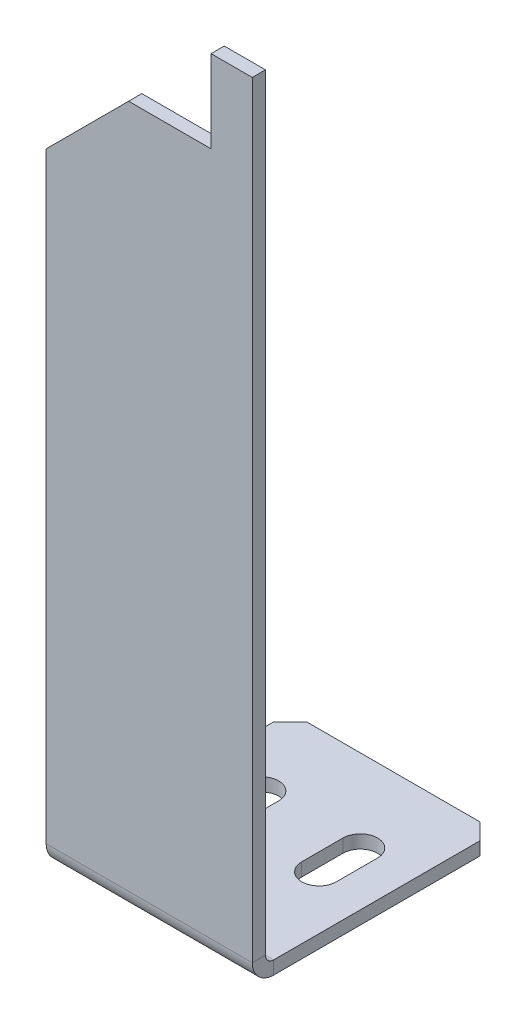
ISO-10303-21;
HEADER;
FILE_DESCRIPTION(('STEP AP214'),'2;1');
FILE_NAME('part.step','',(''),(''),'','','');
FILE_SCHEMA(('AUTOMOTIVE_DESIGN { 1 0 10303 214 1 1 1 1 }'));
ENDSEC;
DATA;
#1=APPLICATION_CONTEXT('core data for automotive mechanical design processes');
#2=APPLICATION_PROTOCOL_DEFINITION('international standard','automotive_design',2000,#1);
#3=PRODUCT_CONTEXT('',#1,'mechanical');
#4=PRODUCT('Part','Part','',(#3));
#5=PRODUCT_RELATED_PRODUCT_CATEGORY('part','',(#4));
#6=PRODUCT_DEFINITION_FORMATION('','',#4);
#7=PRODUCT_DEFINITION_CONTEXT('part definition',#1,'design');
#8=PRODUCT_DEFINITION('design','',#6,#7);
#9=PRODUCT_DEFINITION_SHAPE('','',#8);
#10=(LENGTH_UNIT() NAMED_UNIT(*) SI_UNIT(.MILLI.,.METRE.));
#11=(NAMED_UNIT(*) PLANE_ANGLE_UNIT() SI_UNIT($,.RADIAN.));
#12=(NAMED_UNIT(*) SI_UNIT($,.STERADIAN.) SOLID_ANGLE_UNIT());
#13=UNCERTAINTY_MEASURE_WITH_UNIT(LENGTH_MEASURE(1.E-05),#10,'distance_accuracy_value','');
#14=(GEOMETRIC_REPRESENTATION_CONTEXT(3) GLOBAL_UNCERTAINTY_ASSIGNED_CONTEXT((#13)) GLOBAL_UNIT_ASSIGNED_CONTEXT((#10,
#11,#12)) REPRESENTATION_CONTEXT('',''));
#15=CARTESIAN_POINT('',(0.,0.,0.));
#16=DIRECTION('',(0.,0.,1.));
#17=DIRECTION('',(1.,0.,0.));
#18=AXIS2_PLACEMENT_3D('',#15,#16,#17);
#19=CARTESIAN_POINT('',(24.9999999999999,1.60000000000002,14.0000000000001));
#20=DIRECTION('',(0.,-0.999999999999999,0.));
#21=DIRECTION('',(1.,0.,0.));
#22=AXIS2_PLACEMENT_3D('',#19,#20,#21);
#23=PLANE('',#22);
#24=DIRECTION('',(0.,0.,-0.999999999999999));
#25=VECTOR('',#24,1.);
#26=CARTESIAN_POINT('',(20.6,1.60000000000002,1.00000000000006));
#27=LINE('',#26,#25);
#28=CARTESIAN_POINT('',(20.6,1.60000000000002,1.00000000000006));
#29=VERTEX_POINT('',#28);
#30=CARTESIAN_POINT('',(20.6,1.60000000000002,-3.99999999999995));
#31=VERTEX_POINT('',#30);
#32=EDGE_CURVE('E295',#29,#31,#27,.T.);
#33=ORIENTED_EDGE('',*,*,#32,.F.);
#34=CARTESIAN_POINT('',(18.5,1.59999999999993,1.00000000000006));
#35=DIRECTION('',(0.,-0.999999999999999,0.));
#36=DIRECTION('',(1.,0.,0.));
#37=AXIS2_PLACEMENT_3D('',#34,#35,#36);
#38=CIRCLE('',#37,2.1);
#39=CARTESIAN_POINT('',(16.4,1.59999999999993,1.00000000000006));
#40=VERTEX_POINT('',#39);
#41=EDGE_CURVE('E298',#40,#29,#38,.F.);
#42=ORIENTED_EDGE('',*,*,#41,.F.);
#43=DIRECTION('',(0.,0.,0.999999999999999));
#44=VECTOR('',#43,1.);
#45=CARTESIAN_POINT('',(16.4,1.59999999999993,1.00000000000006));
#46=LINE('',#45,#44);
#47=CARTESIAN_POINT('',(16.4,1.59999999999993,-3.99999999999993));
#48=VERTEX_POINT('',#47);
#49=EDGE_CURVE('E315',#48,#40,#46,.T.);
#50=ORIENTED_EDGE('',*,*,#49,.F.);
#51=CARTESIAN_POINT('',(18.5,1.59999999999993,-3.99999999999995));
#52=DIRECTION('',(0.,-0.999999999999999,0.));
#53=DIRECTION('',(1.,0.,0.));
#54=AXIS2_PLACEMENT_3D('',#51,#52,#53);
#55=CIRCLE('',#54,2.1);
#56=EDGE_CURVE('E293',#31,#48,#55,.F.);
#57=ORIENTED_EDGE('',*,*,#56,.F.);
#58=EDGE_LOOP('',(#33,#42,#50,#57));
#59=FACE_BOUND('',#58,.T.);
#60=DIRECTION('',(0.,0.,-0.999999999999999));
#61=VECTOR('',#60,1.);
#62=CARTESIAN_POINT('',(8.59999999999994,1.59999999999993,1.00000000000006));
#63=LINE('',#62,#61);
#64=CARTESIAN_POINT('',(8.59999999999994,1.59999999999993,1.00000000000006));
#65=VERTEX_POINT('',#64);
#66=CARTESIAN_POINT('',(8.59999999999994,1.59999999999993,-3.99999999999995));
#67=VERTEX_POINT('',#66);
#68=EDGE_CURVE('E264',#65,#67,#63,.T.);
#69=ORIENTED_EDGE('',*,*,#68,.F.);
#70=CARTESIAN_POINT('',(6.49999999999995,1.59999999999993,1.00000000000006));
#71=DIRECTION('',(0.,-0.999999999999999,0.));
#72=DIRECTION('',(1.,0.,0.));
#73=AXIS2_PLACEMENT_3D('',#70,#71,#72);
#74=CIRCLE('',#73,2.1);
#75=CARTESIAN_POINT('',(4.39999999999996,1.59999999999991,1.00000000000006));
#76=VERTEX_POINT('',#75);
#77=EDGE_CURVE('E267',#76,#65,#74,.F.);
#78=ORIENTED_EDGE('',*,*,#77,.F.);
#79=DIRECTION('',(0.,0.,0.999999999999999));
#80=VECTOR('',#79,1.);
#81=CARTESIAN_POINT('',(4.39999999999996,1.59999999999991,1.00000000000006));
#82=LINE('',#81,#80);
#83=CARTESIAN_POINT('',(4.39999999999996,1.59999999999991,-3.99999999999995));
#84=VERTEX_POINT('',#83);
#85=EDGE_CURVE('E284',#84,#76,#82,.T.);
#86=ORIENTED_EDGE('',*,*,#85,.F.);
#87=CARTESIAN_POINT('',(6.49999999999995,1.59999999999993,-3.99999999999995));
#88=DIRECTION('',(0.,-0.999999999999999,0.));
#89=DIRECTION('',(1.,0.,0.));
#90=AXIS2_PLACEMENT_3D('',#87,#88,#89);
#91=CIRCLE('',#90,2.1);
#92=EDGE_CURVE('E260',#67,#84,#91,.F.);
#93=ORIENTED_EDGE('',*,*,#92,.F.);
#94=EDGE_LOOP('',(#69,#78,#86,#93));
#95=FACE_BOUND('',#94,.T.);
#96=DIRECTION('',(0.,0.,-0.999999999999999));
#97=VECTOR('',#96,1.);
#98=CARTESIAN_POINT('',(24.9999999999999,1.60000000000002,14.0000000000001));
#99=LINE('',#98,#97);
#100=CARTESIAN_POINT('',(24.9999999999999,1.60000000000002,13.0000000000001));
#101=VERTEX_POINT('',#100);
#102=CARTESIAN_POINT('',(24.9999999999999,1.60000000000002,-11.9999999999998));
#103=VERTEX_POINT('',#102);
#104=EDGE_CURVE('E329',#101,#103,#99,.T.);
#105=ORIENTED_EDGE('',*,*,#104,.T.);
#106=DIRECTION('',(0.707106781186545,0.,0.707106781186549));
#107=VECTOR('',#106,1.);
#108=CARTESIAN_POINT('',(22.9999999999999,1.60000000000002,-13.9999999999998));
#109=LINE('',#108,#107);
#110=CARTESIAN_POINT('',(22.9999999999999,1.60000000000002,-13.9999999999998));
#111=VERTEX_POINT('',#110);
#112=EDGE_CURVE('E46',#103,#111,#109,.F.);
#113=ORIENTED_EDGE('',*,*,#112,.T.);
#114=DIRECTION('',(-1.,0.,0.));
#115=VECTOR('',#114,1.);
#116=CARTESIAN_POINT('',(24.9999999999999,1.60000000000002,-13.9999999999998));
#117=LINE('',#116,#115);
#118=CARTESIAN_POINT('',(2.,1.59999999999999,-13.9999999999999));
#119=VERTEX_POINT('',#118);
#120=EDGE_CURVE('E324',#111,#119,#117,.T.);
#121=ORIENTED_EDGE('',*,*,#120,.T.);
#122=DIRECTION('',(0.707106781186545,0.,-0.707106781186549));
#123=VECTOR('',#122,1.);
#124=CARTESIAN_POINT('',(2.,1.59999999999999,-13.9999999999998));
#125=LINE('',#124,#123);
#126=CARTESIAN_POINT('',(0.,1.59999999999999,-11.9999999999998));
#127=VERTEX_POINT('',#126);
#128=EDGE_CURVE('E53',#119,#127,#125,.F.);
#129=ORIENTED_EDGE('',*,*,#128,.T.);
#130=DIRECTION('',(0.,0.,-0.999999999999999));
#131=VECTOR('',#130,1.);
#132=CARTESIAN_POINT('',(0.,1.59999999999999,14.0000000000001));
#133=LINE('',#132,#131);
#134=CARTESIAN_POINT('',(0.,1.59999999999999,13.0000000000001));
#135=VERTEX_POINT('',#134);
#136=EDGE_CURVE('E336',#135,#127,#133,.T.);
#137=ORIENTED_EDGE('',*,*,#136,.F.);
#138=DIRECTION('',(1.,0.,0.));
#139=VECTOR('',#138,1.);
#140=CARTESIAN_POINT('',(24.9999999999999,1.60000000000002,13.0000000000001));
#141=LINE('',#140,#139);
#142=EDGE_CURVE('E253',#101,#135,#141,.F.);
#143=ORIENTED_EDGE('',*,*,#142,.F.);
#144=EDGE_LOOP('',(#105,#113,#121,#129,#137,#143));
#145=FACE_BOUND('',#144,.T.);
#146=ADVANCED_FACE('F38',(#59,#95,#145),#23,.F.);
#147=CARTESIAN_POINT('',(24.9999999999999,0.,14.0000000000001));
#148=DIRECTION('',(0.,-0.999999999999999,0.));
#149=DIRECTION('',(1.,0.,0.));
#150=AXIS2_PLACEMENT_3D('',#147,#148,#149);
#151=PLANE('',#150);
#152=CARTESIAN_POINT('',(18.5,0.,1.00000000000006));
#153=DIRECTION('',(0.,-0.999999999999999,0.));
#154=DIRECTION('',(-1.,0.,0.));
#155=AXIS2_PLACEMENT_3D('',#152,#153,#154);
#156=CIRCLE('',#155,2.1);
#157=CARTESIAN_POINT('',(20.6,0.,1.00000000000006));
#158=VERTEX_POINT('',#157);
#159=CARTESIAN_POINT('',(16.4,0.,1.00000000000006));
#160=VERTEX_POINT('',#159);
#161=EDGE_CURVE('E301',#158,#160,#156,.T.);
#162=ORIENTED_EDGE('',*,*,#161,.F.);
#163=DIRECTION('',(0.,0.,0.999999999999999));
#164=VECTOR('',#163,1.);
#165=CARTESIAN_POINT('',(20.6,0.,1.00000000000006));
#166=LINE('',#165,#164);
#167=CARTESIAN_POINT('',(20.6,0.,-3.99999999999995));
#168=VERTEX_POINT('',#167);
#169=EDGE_CURVE('E309',#168,#158,#166,.T.);
#170=ORIENTED_EDGE('',*,*,#169,.F.);
#171=CARTESIAN_POINT('',(18.5,0.,-3.99999999999995));
#172=DIRECTION('',(0.,-0.999999999999999,0.));
#173=DIRECTION('',(1.,0.,0.));
#174=AXIS2_PLACEMENT_3D('',#171,#172,#173);
#175=CIRCLE('',#174,2.1);
#176=CARTESIAN_POINT('',(16.4,0.,-3.99999999999995));
#177=VERTEX_POINT('',#176);
#178=EDGE_CURVE('E306',#177,#168,#175,.T.);
#179=ORIENTED_EDGE('',*,*,#178,.F.);
#180=DIRECTION('',(0.,0.,-0.999999999999999));
#181=VECTOR('',#180,1.);
#182=CARTESIAN_POINT('',(16.4,0.,1.00000000000006));
#183=LINE('',#182,#181);
#184=EDGE_CURVE('E303',#160,#177,#183,.T.);
#185=ORIENTED_EDGE('',*,*,#184,.F.);
#186=EDGE_LOOP('',(#162,#170,#179,#185));
#187=FACE_BOUND('',#186,.T.);
#188=CARTESIAN_POINT('',(6.49999999999995,0.,1.00000000000006));
#189=DIRECTION('',(0.,-0.999999999999999,0.));
#190=DIRECTION('',(-1.,0.,0.));
#191=AXIS2_PLACEMENT_3D('',#188,#189,#190);
#192=CIRCLE('',#191,2.1);
#193=CARTESIAN_POINT('',(8.59999999999994,0.,1.00000000000006));
#194=VERTEX_POINT('',#193);
#195=CARTESIAN_POINT('',(4.39999999999996,0.,1.00000000000006));
#196=VERTEX_POINT('',#195);
#197=EDGE_CURVE('E270',#194,#196,#192,.T.);
#198=ORIENTED_EDGE('',*,*,#197,.F.);
#199=DIRECTION('',(0.,0.,0.999999999999999));
#200=VECTOR('',#199,1.);
#201=CARTESIAN_POINT('',(8.59999999999994,0.,1.00000000000006));
#202=LINE('',#201,#200);
#203=CARTESIAN_POINT('',(8.59999999999994,0.,-3.99999999999995));
#204=VERTEX_POINT('',#203);
#205=EDGE_CURVE('E278',#204,#194,#202,.T.);
#206=ORIENTED_EDGE('',*,*,#205,.F.);
#207=CARTESIAN_POINT('',(6.49999999999995,0.,-3.99999999999995));
#208=DIRECTION('',(0.,-0.999999999999999,0.));
#209=DIRECTION('',(1.,0.,0.));
#210=AXIS2_PLACEMENT_3D('',#207,#208,#209);
#211=CIRCLE('',#210,2.1);
#212=CARTESIAN_POINT('',(4.39999999999996,0.,-3.99999999999995));
#213=VERTEX_POINT('',#212);
#214=EDGE_CURVE('E275',#213,#204,#211,.T.);
#215=ORIENTED_EDGE('',*,*,#214,.F.);
#216=DIRECTION('',(0.,0.,-0.999999999999999));
#217=VECTOR('',#216,1.);
#218=CARTESIAN_POINT('',(4.39999999999996,0.,1.00000000000006));
#219=LINE('',#218,#217);
#220=EDGE_CURVE('E272',#196,#213,#219,.T.);
#221=ORIENTED_EDGE('',*,*,#220,.F.);
#222=EDGE_LOOP('',(#198,#206,#215,#221));
#223=FACE_BOUND('',#222,.T.);
#224=DIRECTION('',(-1.,0.,0.));
#225=VECTOR('',#224,1.);
#226=CARTESIAN_POINT('',(24.9999999999999,0.,-13.9999999999998));
#227=LINE('',#226,#225);
#228=CARTESIAN_POINT('',(22.9999999999999,0.,-13.9999999999998));
#229=VERTEX_POINT('',#228);
#230=CARTESIAN_POINT('',(2.,0.,-13.9999999999999));
#231=VERTEX_POINT('',#230);
#232=EDGE_CURVE('E326',#229,#231,#227,.T.);
#233=ORIENTED_EDGE('',*,*,#232,.F.);
#234=DIRECTION('',(-0.707106781186545,0.,-0.707106781186549));
#235=VECTOR('',#234,1.);
#236=CARTESIAN_POINT('',(38.,0.,1.00000000000015));
#237=LINE('',#236,#235);
#238=CARTESIAN_POINT('',(24.9999999999999,0.,-11.9999999999998));
#239=VERTEX_POINT('',#238);
#240=EDGE_CURVE('E354',#229,#239,#237,.F.);
#241=ORIENTED_EDGE('',*,*,#240,.T.);
#242=DIRECTION('',(0.,0.,-0.999999999999999));
#243=VECTOR('',#242,1.);
#244=CARTESIAN_POINT('',(24.9999999999999,0.,14.0000000000001));
#245=LINE('',#244,#243);
#246=CARTESIAN_POINT('',(24.9999999999999,0.,13.0000000000001));
#247=VERTEX_POINT('',#246);
#248=EDGE_CURVE('E331',#247,#239,#245,.T.);
#249=ORIENTED_EDGE('',*,*,#248,.F.);
#250=DIRECTION('',(1.,0.,0.));
#251=VECTOR('',#250,1.);
#252=CARTESIAN_POINT('',(24.9999999999999,0.,13.0000000000001));
#253=LINE('',#252,#251);
#254=CARTESIAN_POINT('',(0.,0.,13.0000000000001));
#255=VERTEX_POINT('',#254);
#256=EDGE_CURVE('E240',#247,#255,#253,.F.);
#257=ORIENTED_EDGE('',*,*,#256,.T.);
#258=DIRECTION('',(0.,0.,-0.999999999999999));
#259=VECTOR('',#258,1.);
#260=CARTESIAN_POINT('',(0.,0.,14.0000000000001));
#261=LINE('',#260,#259);
#262=CARTESIAN_POINT('',(0.,0.,-11.9999999999998));
#263=VERTEX_POINT('',#262);
#264=EDGE_CURVE('E333',#255,#263,#261,.T.);
#265=ORIENTED_EDGE('',*,*,#264,.T.);
#266=DIRECTION('',(-0.707106781186545,0.,0.707106781186549));
#267=VECTOR('',#266,1.);
#268=CARTESIAN_POINT('',(-0.500000000000174,0.,-11.4999999999998));
#269=LINE('',#268,#267);
#270=EDGE_CURVE('E352',#263,#231,#269,.F.);
#271=ORIENTED_EDGE('',*,*,#270,.T.);
#272=EDGE_LOOP('',(#233,#241,#249,#257,#265,#271));
#273=FACE_BOUND('',#272,.T.);
#274=ADVANCED_FACE('F369',(#187,#223,#273),#151,.T.);
#275=CARTESIAN_POINT('',(24.9999999999999,1.60000000000002,14.0000000000001));
#276=DIRECTION('',(1.,0.,0.));
#277=DIRECTION('',(0.,0.,-0.999999999999999));
#278=AXIS2_PLACEMENT_3D('',#275,#276,#277);
#279=PLANE('',#278);
#280=ORIENTED_EDGE('',*,*,#248,.T.);
#281=DIRECTION('',(0.,0.999999999999999,0.));
#282=VECTOR('',#281,1.);
#283=CARTESIAN_POINT('',(24.9999999999999,1.60000000000002,-11.9999999999998));
#284=LINE('',#283,#282);
#285=EDGE_CURVE('E61',#239,#103,#284,.T.);
#286=ORIENTED_EDGE('',*,*,#285,.T.);
#287=ORIENTED_EDGE('',*,*,#104,.F.);
#288=DIRECTION('',(0.,-0.999999999999999,0.));
#289=VECTOR('',#288,1.);
#290=CARTESIAN_POINT('',(24.9999999999999,1.60000000000002,13.0000000000001));
#291=LINE('',#290,#289);
#292=EDGE_CURVE('E247',#101,#247,#291,.T.);
#293=ORIENTED_EDGE('',*,*,#292,.T.);
#294=EDGE_LOOP('',(#280,#286,#287,#293));
#295=FACE_BOUND('',#294,.T.);
#296=ADVANCED_FACE('F370',(#295),#279,.T.);
#297=CARTESIAN_POINT('',(0.,0.,14.0000000000001));
#298=DIRECTION('',(-1.,0.,0.));
#299=DIRECTION('',(0.,0.,0.999999999999999));
#300=AXIS2_PLACEMENT_3D('',#297,#298,#299);
#301=PLANE('',#300);
#302=ORIENTED_EDGE('',*,*,#136,.T.);
#303=DIRECTION('',(0.,-0.999999999999999,0.));
#304=VECTOR('',#303,1.);
#305=CARTESIAN_POINT('',(0.,0.,-11.9999999999998));
#306=LINE('',#305,#304);
#307=EDGE_CURVE('E11',#127,#263,#306,.T.);
#308=ORIENTED_EDGE('',*,*,#307,.T.);
#309=ORIENTED_EDGE('',*,*,#264,.F.);
#310=DIRECTION('',(0.,-0.999999999999999,0.));
#311=VECTOR('',#310,1.);
#312=CARTESIAN_POINT('',(0.,1.59999999999999,13.0000000000001));
#313=LINE('',#312,#311);
#314=EDGE_CURVE('E257',#135,#255,#313,.T.);
#315=ORIENTED_EDGE('',*,*,#314,.F.);
#316=EDGE_LOOP('',(#302,#308,#309,#315));
#317=FACE_BOUND('',#316,.T.);
#318=ADVANCED_FACE('F382',(#317),#301,.T.);
#319=CARTESIAN_POINT('',(0.,1.59999999999999,-13.9999999999998));
#320=DIRECTION('',(0.,0.,-0.999999999999999));
#321=DIRECTION('',(-1.,0.,0.));
#322=AXIS2_PLACEMENT_3D('',#319,#320,#321);
#323=PLANE('',#322);
#324=ORIENTED_EDGE('',*,*,#120,.F.);
#325=DIRECTION('',(0.,-0.999999999999999,0.));
#326=VECTOR('',#325,1.);
#327=CARTESIAN_POINT('',(22.9999999999999,1.60000000000002,-13.9999999999998));
#328=LINE('',#327,#326);
#329=EDGE_CURVE('E349',#111,#229,#328,.T.);
#330=ORIENTED_EDGE('',*,*,#329,.T.);
#331=ORIENTED_EDGE('',*,*,#232,.T.);
#332=DIRECTION('',(0.,0.999999999999999,0.));
#333=VECTOR('',#332,1.);
#334=CARTESIAN_POINT('',(2.,1.59999999999999,-13.9999999999998));
#335=LINE('',#334,#333);
#336=EDGE_CURVE('E346',#231,#119,#335,.T.);
#337=ORIENTED_EDGE('',*,*,#336,.T.);
#338=EDGE_LOOP('',(#324,#330,#331,#337));
#339=FACE_BOUND('',#338,.T.);
#340=ADVANCED_FACE('F363',(#339),#323,.T.);
#341=CARTESIAN_POINT('',(18.5,1.60099999999994,1.00000000000006));
#342=DIRECTION('',(0.,-0.999999999999999,0.));
#343=DIRECTION('',(1.,0.,0.));
#344=AXIS2_PLACEMENT_3D('',#341,#342,#343);
#345=CYLINDRICAL_SURFACE('',#344,2.1);
#346=ORIENTED_EDGE('',*,*,#41,.T.);
#347=DIRECTION('',(0.,-0.999999999999999,0.));
#348=VECTOR('',#347,1.);
#349=CARTESIAN_POINT('',(20.6,1.60100000000002,1.00000000000006));
#350=LINE('',#349,#348);
#351=EDGE_CURVE('E313',#29,#158,#350,.T.);
#352=ORIENTED_EDGE('',*,*,#351,.T.);
#353=ORIENTED_EDGE('',*,*,#161,.T.);
#354=DIRECTION('',(0.,-0.999999999999999,0.));
#355=VECTOR('',#354,1.);
#356=CARTESIAN_POINT('',(16.4,1.60099999999994,1.00000000000006));
#357=LINE('',#356,#355);
#358=EDGE_CURVE('E312',#40,#160,#357,.T.);
#359=ORIENTED_EDGE('',*,*,#358,.F.);
#360=EDGE_LOOP('',(#346,#352,#353,#359));
#361=FACE_BOUND('',#360,.T.);
#362=ADVANCED_FACE('F615',(#361),#345,.F.);
#363=CARTESIAN_POINT('',(20.6,1.60100000000002,1.00000000000006));
#364=DIRECTION('',(1.,0.,0.));
#365=DIRECTION('',(0.,0.999999999999999,0.));
#366=AXIS2_PLACEMENT_3D('',#363,#364,#365);
#367=PLANE('',#366);
#368=ORIENTED_EDGE('',*,*,#32,.T.);
#369=DIRECTION('',(0.,-0.999999999999999,0.));
#370=VECTOR('',#369,1.);
#371=CARTESIAN_POINT('',(20.6,1.60100000000002,-3.99999999999995));
#372=LINE('',#371,#370);
#373=EDGE_CURVE('E316',#31,#168,#372,.T.);
#374=ORIENTED_EDGE('',*,*,#373,.T.);
#375=ORIENTED_EDGE('',*,*,#169,.T.);
#376=ORIENTED_EDGE('',*,*,#351,.F.);
#377=EDGE_LOOP('',(#368,#374,#375,#376));
#378=FACE_BOUND('',#377,.T.);
#379=ADVANCED_FACE('F604',(#378),#367,.F.);
#380=CARTESIAN_POINT('',(18.5,1.60099999999994,-3.99999999999995));
#381=DIRECTION('',(0.,-0.999999999999999,0.));
#382=DIRECTION('',(1.,0.,0.));
#383=AXIS2_PLACEMENT_3D('',#380,#381,#382);
#384=CYLINDRICAL_SURFACE('',#383,2.1);
#385=ORIENTED_EDGE('',*,*,#56,.T.);
#386=DIRECTION('',(0.,-0.999999999999999,0.));
#387=VECTOR('',#386,1.);
#388=CARTESIAN_POINT('',(16.4,1.60099999999994,-3.99999999999995));
#389=LINE('',#388,#387);
#390=EDGE_CURVE('E318',#48,#177,#389,.T.);
#391=ORIENTED_EDGE('',*,*,#390,.T.);
#392=ORIENTED_EDGE('',*,*,#178,.T.);
#393=ORIENTED_EDGE('',*,*,#373,.F.);
#394=EDGE_LOOP('',(#385,#391,#392,#393));
#395=FACE_BOUND('',#394,.T.);
#396=ADVANCED_FACE('F593',(#395),#384,.F.);
#397=CARTESIAN_POINT('',(16.4,1.60099999999994,1.00000000000006));
#398=DIRECTION('',(-1.,0.,0.));
#399=DIRECTION('',(0.,-0.999999999999999,0.));
#400=AXIS2_PLACEMENT_3D('',#397,#398,#399);
#401=PLANE('',#400);
#402=ORIENTED_EDGE('',*,*,#49,.T.);
#403=ORIENTED_EDGE('',*,*,#358,.T.);
#404=ORIENTED_EDGE('',*,*,#184,.T.);
#405=ORIENTED_EDGE('',*,*,#390,.F.);
#406=EDGE_LOOP('',(#402,#403,#404,#405));
#407=FACE_BOUND('',#406,.T.);
#408=ADVANCED_FACE('F582',(#407),#401,.F.);
#409=CARTESIAN_POINT('',(6.49999999999995,1.60099999999991,1.00000000000006));
#410=DIRECTION('',(0.,-0.999999999999999,0.));
#411=DIRECTION('',(1.,0.,0.));
#412=AXIS2_PLACEMENT_3D('',#409,#410,#411);
#413=CYLINDRICAL_SURFACE('',#412,2.1);
#414=ORIENTED_EDGE('',*,*,#77,.T.);
#415=DIRECTION('',(0.,-0.999999999999999,0.));
#416=VECTOR('',#415,1.);
#417=CARTESIAN_POINT('',(8.59999999999994,1.60099999999994,1.00000000000006));
#418=LINE('',#417,#416);
#419=EDGE_CURVE('E282',#65,#194,#418,.T.);
#420=ORIENTED_EDGE('',*,*,#419,.T.);
#421=ORIENTED_EDGE('',*,*,#197,.T.);
#422=DIRECTION('',(0.,-0.999999999999999,0.));
#423=VECTOR('',#422,1.);
#424=CARTESIAN_POINT('',(4.39999999999996,1.60099999999991,1.00000000000006));
#425=LINE('',#424,#423);
#426=EDGE_CURVE('E281',#76,#196,#425,.T.);
#427=ORIENTED_EDGE('',*,*,#426,.F.);
#428=EDGE_LOOP('',(#414,#420,#421,#427));
#429=FACE_BOUND('',#428,.T.);
#430=ADVANCED_FACE('F571',(#429),#413,.F.);
#431=CARTESIAN_POINT('',(8.59999999999994,1.60099999999994,1.00000000000006));
#432=DIRECTION('',(1.,0.,0.));
#433=DIRECTION('',(0.,0.999999999999999,0.));
#434=AXIS2_PLACEMENT_3D('',#431,#432,#433);
#435=PLANE('',#434);
#436=ORIENTED_EDGE('',*,*,#68,.T.);
#437=DIRECTION('',(0.,-0.999999999999999,0.));
#438=VECTOR('',#437,1.);
#439=CARTESIAN_POINT('',(8.59999999999994,1.60099999999994,-3.99999999999995));
#440=LINE('',#439,#438);
#441=EDGE_CURVE('E285',#67,#204,#440,.T.);
#442=ORIENTED_EDGE('',*,*,#441,.T.);
#443=ORIENTED_EDGE('',*,*,#205,.T.);
#444=ORIENTED_EDGE('',*,*,#419,.F.);
#445=EDGE_LOOP('',(#436,#442,#443,#444));
#446=FACE_BOUND('',#445,.T.);
#447=ADVANCED_FACE('F560',(#446),#435,.F.);
#448=CARTESIAN_POINT('',(6.49999999999995,1.60099999999994,-3.99999999999995));
#449=DIRECTION('',(0.,-0.999999999999999,0.));
#450=DIRECTION('',(1.,0.,0.));
#451=AXIS2_PLACEMENT_3D('',#448,#449,#450);
#452=CYLINDRICAL_SURFACE('',#451,2.1);
#453=ORIENTED_EDGE('',*,*,#92,.T.);
#454=DIRECTION('',(0.,-0.999999999999999,0.));
#455=VECTOR('',#454,1.);
#456=CARTESIAN_POINT('',(4.39999999999996,1.60099999999991,-3.99999999999995));
#457=LINE('',#456,#455);
#458=EDGE_CURVE('E287',#84,#213,#457,.T.);
#459=ORIENTED_EDGE('',*,*,#458,.T.);
#460=ORIENTED_EDGE('',*,*,#214,.T.);
#461=ORIENTED_EDGE('',*,*,#441,.F.);
#462=EDGE_LOOP('',(#453,#459,#460,#461));
#463=FACE_BOUND('',#462,.T.);
#464=ADVANCED_FACE('F548',(#463),#452,.F.);
#465=CARTESIAN_POINT('',(4.39999999999996,1.60099999999991,1.00000000000006));
#466=DIRECTION('',(-1.,0.,0.));
#467=DIRECTION('',(0.,0.,0.999999999999999));
#468=AXIS2_PLACEMENT_3D('',#465,#466,#467);
#469=PLANE('',#468);
#470=ORIENTED_EDGE('',*,*,#85,.T.);
#471=ORIENTED_EDGE('',*,*,#426,.T.);
#472=ORIENTED_EDGE('',*,*,#220,.T.);
#473=ORIENTED_EDGE('',*,*,#458,.F.);
#474=EDGE_LOOP('',(#470,#471,#472,#473));
#475=FACE_BOUND('',#474,.T.);
#476=ADVANCED_FACE('F537',(#475),#469,.F.);
#477=CARTESIAN_POINT('',(0.,2.59999999999999,13.0000000000001));
#478=DIRECTION('',(-1.,0.,0.));
#479=DIRECTION('',(0.,0.,0.999999999999999));
#480=AXIS2_PLACEMENT_3D('',#477,#478,#479);
#481=PLANE('',#480);
#482=DIRECTION('',(0.,0.,0.999999999999999));
#483=VECTOR('',#482,1.);
#484=CARTESIAN_POINT('',(0.,2.59999999999999,14.0000000000001));
#485=LINE('',#484,#483);
#486=CARTESIAN_POINT('',(0.,2.59999999999999,14.0000000000001));
#487=VERTEX_POINT('',#486);
#488=CARTESIAN_POINT('',(0.,2.59999999999999,15.6000000000001));
#489=VERTEX_POINT('',#488);
#490=EDGE_CURVE('E201',#487,#489,#485,.T.);
#491=ORIENTED_EDGE('',*,*,#490,.F.);
#492=CARTESIAN_POINT('',(0.,2.59999999999999,13.0000000000001));
#493=DIRECTION('',(1.,0.,0.));
#494=DIRECTION('',(0.,0.,-0.999999999999999));
#495=AXIS2_PLACEMENT_3D('',#492,#493,#494);
#496=CIRCLE('',#495,0.999999999999997);
#497=EDGE_CURVE('E250',#135,#487,#496,.F.);
#498=ORIENTED_EDGE('',*,*,#497,.F.);
#499=ORIENTED_EDGE('',*,*,#314,.T.);
#500=CARTESIAN_POINT('',(0.,2.59999999999999,13.0000000000001));
#501=DIRECTION('',(1.,0.,0.));
#502=DIRECTION('',(0.,0.,-0.999999999999999));
#503=AXIS2_PLACEMENT_3D('',#500,#501,#502);
#504=CIRCLE('',#503,2.6);
#505=EDGE_CURVE('E243',#255,#489,#504,.F.);
#506=ORIENTED_EDGE('',*,*,#505,.T.);
#507=EDGE_LOOP('',(#491,#498,#499,#506));
#508=FACE_BOUND('',#507,.T.);
#509=ADVANCED_FACE('F391',(#508),#481,.T.);
#510=CARTESIAN_POINT('',(24.9999999999999,2.60000000000002,13.0000000000001));
#511=DIRECTION('',(-1.,0.,0.));
#512=DIRECTION('',(0.,0.,0.999999999999999));
#513=AXIS2_PLACEMENT_3D('',#510,#511,#512);
#514=PLANE('',#513);
#515=CARTESIAN_POINT('',(24.9999999999999,2.60000000000002,13.0000000000001));
#516=DIRECTION('',(1.,0.,0.));
#517=DIRECTION('',(0.,0.,-0.999999999999999));
#518=AXIS2_PLACEMENT_3D('',#515,#516,#517);
#519=CIRCLE('',#518,0.999999999999997);
#520=CARTESIAN_POINT('',(24.9999999999999,2.60000000000002,14.0000000000001));
#521=VERTEX_POINT('',#520);
#522=EDGE_CURVE('E239',#521,#101,#519,.T.);
#523=ORIENTED_EDGE('',*,*,#522,.F.);
#524=DIRECTION('',(0.,0.,0.999999999999999));
#525=VECTOR('',#524,1.);
#526=CARTESIAN_POINT('',(24.9999999999999,2.60000000000002,14.0000000000001));
#527=LINE('',#526,#525);
#528=CARTESIAN_POINT('',(24.9999999999999,2.60000000000002,15.6000000000001));
#529=VERTEX_POINT('',#528);
#530=EDGE_CURVE('E216',#521,#529,#527,.T.);
#531=ORIENTED_EDGE('',*,*,#530,.T.);
#532=CARTESIAN_POINT('',(24.9999999999999,2.60000000000002,13.0000000000001));
#533=DIRECTION('',(1.,0.,0.));
#534=DIRECTION('',(0.,0.,-0.999999999999999));
#535=AXIS2_PLACEMENT_3D('',#532,#533,#534);
#536=CIRCLE('',#535,2.6);
#537=EDGE_CURVE('E244',#529,#247,#536,.T.);
#538=ORIENTED_EDGE('',*,*,#537,.T.);
#539=ORIENTED_EDGE('',*,*,#292,.F.);
#540=EDGE_LOOP('',(#523,#531,#538,#539));
#541=FACE_BOUND('',#540,.T.);
#542=ADVANCED_FACE('F373',(#541),#514,.F.);
#543=CARTESIAN_POINT('',(24.9999999999999,2.60000000000002,13.0000000000001));
#544=DIRECTION('',(1.,0.,0.));
#545=DIRECTION('',(0.,0.,0.999999999999999));
#546=AXIS2_PLACEMENT_3D('',#543,#544,#545);
#547=CYLINDRICAL_SURFACE('',#546,2.6);
#548=ORIENTED_EDGE('',*,*,#256,.F.);
#549=ORIENTED_EDGE('',*,*,#537,.F.);
#550=DIRECTION('',(1.,0.,0.));
#551=VECTOR('',#550,1.);
#552=CARTESIAN_POINT('',(24.9999999999999,2.60000000000002,15.6000000000001));
#553=LINE('',#552,#551);
#554=EDGE_CURVE('E219',#489,#529,#553,.T.);
#555=ORIENTED_EDGE('',*,*,#554,.F.);
#556=ORIENTED_EDGE('',*,*,#505,.F.);
#557=EDGE_LOOP('',(#548,#549,#555,#556));
#558=FACE_BOUND('',#557,.T.);
#559=ADVANCED_FACE('F387',(#558),#547,.T.);
#560=CARTESIAN_POINT('',(24.9999999999999,2.60000000000002,13.0000000000001));
#561=DIRECTION('',(1.,0.,0.));
#562=DIRECTION('',(0.,0.,0.999999999999999));
#563=AXIS2_PLACEMENT_3D('',#560,#561,#562);
#564=CYLINDRICAL_SURFACE('',#563,0.999999999999997);
#565=ORIENTED_EDGE('',*,*,#142,.T.);
#566=ORIENTED_EDGE('',*,*,#497,.T.);
#567=DIRECTION('',(1.,0.,0.));
#568=VECTOR('',#567,1.);
#569=CARTESIAN_POINT('',(0.,2.59999999999999,14.0000000000001));
#570=LINE('',#569,#568);
#571=EDGE_CURVE('E214',#487,#521,#570,.T.);
#572=ORIENTED_EDGE('',*,*,#571,.T.);
#573=ORIENTED_EDGE('',*,*,#522,.T.);
#574=EDGE_LOOP('',(#565,#566,#572,#573));
#575=FACE_BOUND('',#574,.T.);
#576=ADVANCED_FACE('F376',(#575),#564,.F.);
#577=CARTESIAN_POINT('',(25.0000000000001,95.5999999999998,15.6000000000001));
#578=DIRECTION('',(-1.,0.,0.));
#579=DIRECTION('',(0.,-0.999999999999999,0.));
#580=AXIS2_PLACEMENT_3D('',#577,#578,#579);
#581=PLANE('',#580);
#582=ORIENTED_EDGE('',*,*,#530,.F.);
#583=DIRECTION('',(0.,0.999999999999999,0.));
#584=VECTOR('',#583,1.);
#585=CARTESIAN_POINT('',(25.0000000000001,95.5999999999998,14.0000000000001));
#586=LINE('',#585,#584);
#587=CARTESIAN_POINT('',(25.0000000000001,95.5999999999998,14.0000000000001));
#588=VERTEX_POINT('',#587);
#589=EDGE_CURVE('E224',#521,#588,#586,.T.);
#590=ORIENTED_EDGE('',*,*,#589,.T.);
#591=DIRECTION('',(0.,0.,-0.999999999999999));
#592=VECTOR('',#591,1.);
#593=CARTESIAN_POINT('',(25.0000000000001,95.5999999999998,15.6000000000001));
#594=LINE('',#593,#592);
#595=CARTESIAN_POINT('',(25.0000000000001,95.5999999999998,15.6000000000001));
#596=VERTEX_POINT('',#595);
#597=EDGE_CURVE('E231',#596,#588,#594,.T.);
#598=ORIENTED_EDGE('',*,*,#597,.F.);
#599=DIRECTION('',(0.,0.999999999999999,0.));
#600=VECTOR('',#599,1.);
#601=CARTESIAN_POINT('',(25.0000000000001,95.5999999999998,15.6000000000001));
#602=LINE('',#601,#600);
#603=EDGE_CURVE('E225',#529,#596,#602,.T.);
#604=ORIENTED_EDGE('',*,*,#603,.F.);
#605=EDGE_LOOP('',(#582,#590,#598,#604));
#606=FACE_BOUND('',#605,.T.);
#607=ADVANCED_FACE('F400',(#606),#581,.F.);
#608=CARTESIAN_POINT('',(0.,1.59999999999999,15.6000000000001));
#609=DIRECTION('',(1.,0.,0.));
#610=DIRECTION('',(0.,0.999999999999999,0.));
#611=AXIS2_PLACEMENT_3D('',#608,#609,#610);
#612=PLANE('',#611);
#613=DIRECTION('',(0.,-0.999999999999999,0.));
#614=VECTOR('',#613,1.);
#615=CARTESIAN_POINT('',(0.,1.59999999999999,15.6000000000001));
#616=LINE('',#615,#614);
#617=CARTESIAN_POINT('',(2.22044604925031E-13,75.6,15.6));
#618=VERTEX_POINT('',#617);
#619=EDGE_CURVE('E229',#618,#489,#616,.T.);
#620=ORIENTED_EDGE('',*,*,#619,.F.);
#621=DIRECTION('',(0.,0.,-0.999999999999999));
#622=VECTOR('',#621,1.);
#623=CARTESIAN_POINT('',(2.22044604925031E-13,75.6,15.6));
#624=LINE('',#623,#622);
#625=CARTESIAN_POINT('',(2.22044604925031E-13,75.6,14.));
#626=VERTEX_POINT('',#625);
#627=EDGE_CURVE('E338',#618,#626,#624,.T.);
#628=ORIENTED_EDGE('',*,*,#627,.T.);
#629=DIRECTION('',(0.,-0.999999999999999,0.));
#630=VECTOR('',#629,1.);
#631=CARTESIAN_POINT('',(0.,1.59999999999999,14.0000000000001));
#632=LINE('',#631,#630);
#633=EDGE_CURVE('E227',#626,#487,#632,.T.);
#634=ORIENTED_EDGE('',*,*,#633,.T.);
#635=ORIENTED_EDGE('',*,*,#490,.T.);
#636=EDGE_LOOP('',(#620,#628,#634,#635));
#637=FACE_BOUND('',#636,.T.);
#638=ADVANCED_FACE('F404',(#637),#612,.F.);
#639=CARTESIAN_POINT('',(25.0000000000001,95.5999999999998,15.6000000000001));
#640=DIRECTION('',(0.,0.,0.999999999999999));
#641=DIRECTION('',(1.,0.,0.));
#642=AXIS2_PLACEMENT_3D('',#639,#640,#641);
#643=PLANE('',#642);
#644=DIRECTION('',(-1.,0.,0.));
#645=VECTOR('',#644,1.);
#646=CARTESIAN_POINT('',(2.22044604925031E-13,85.5999999999998,15.6));
#647=LINE('',#646,#645);
#648=CARTESIAN_POINT('',(20.0000000000002,85.5999999999998,15.6));
#649=VERTEX_POINT('',#648);
#650=CARTESIAN_POINT('',(10.0000000000002,85.5999999999998,15.6000000000001));
#651=VERTEX_POINT('',#650);
#652=EDGE_CURVE('E182',#649,#651,#647,.T.);
#653=ORIENTED_EDGE('',*,*,#652,.T.);
#654=DIRECTION('',(0.70710678118655,0.707106781186545,0.));
#655=VECTOR('',#654,1.);
#656=CARTESIAN_POINT('',(22.5000000000002,98.0999999999997,15.6));
#657=LINE('',#656,#655);
#658=EDGE_CURVE('E344',#651,#618,#657,.F.);
#659=ORIENTED_EDGE('',*,*,#658,.T.);
#660=ORIENTED_EDGE('',*,*,#619,.T.);
#661=ORIENTED_EDGE('',*,*,#554,.T.);
#662=ORIENTED_EDGE('',*,*,#603,.T.);
#663=DIRECTION('',(-1.,0.,0.));
#664=VECTOR('',#663,1.);
#665=CARTESIAN_POINT('',(2.22044604925031E-13,95.5999999999998,15.6));
#666=LINE('',#665,#664);
#667=CARTESIAN_POINT('',(20.0000000000002,95.5999999999998,15.6));
#668=VERTEX_POINT('',#667);
#669=EDGE_CURVE('E207',#596,#668,#666,.T.);
#670=ORIENTED_EDGE('',*,*,#669,.T.);
#671=DIRECTION('',(0.,-0.999999999999999,0.));
#672=VECTOR('',#671,1.);
#673=CARTESIAN_POINT('',(20.0000000000002,95.5999999999998,15.6));
#674=LINE('',#673,#672);
#675=EDGE_CURVE('E194',#668,#649,#674,.T.);
#676=ORIENTED_EDGE('',*,*,#675,.T.);
#677=EDGE_LOOP('',(#653,#659,#660,#661,#662,#670,#676));
#678=FACE_BOUND('',#677,.T.);
#679=ADVANCED_FACE('F205',(#678),#643,.T.);
#680=CARTESIAN_POINT('',(25.0000000000001,95.5999999999998,14.0000000000001));
#681=DIRECTION('',(0.,0.,0.999999999999999));
#682=DIRECTION('',(1.,0.,0.));
#683=AXIS2_PLACEMENT_3D('',#680,#681,#682);
#684=PLANE('',#683);
#685=ORIENTED_EDGE('',*,*,#633,.F.);
#686=DIRECTION('',(-0.70710678118655,-0.707106781186545,0.));
#687=VECTOR('',#686,1.);
#688=CARTESIAN_POINT('',(2.22044604925031E-13,75.6,14.));
#689=LINE('',#688,#687);
#690=CARTESIAN_POINT('',(10.0000000000002,85.5999999999998,14.0000000000001));
#691=VERTEX_POINT('',#690);
#692=EDGE_CURVE('E341',#626,#691,#689,.F.);
#693=ORIENTED_EDGE('',*,*,#692,.T.);
#694=DIRECTION('',(-1.,0.,0.));
#695=VECTOR('',#694,1.);
#696=CARTESIAN_POINT('',(2.22044604925031E-13,85.5999999999998,14.));
#697=LINE('',#696,#695);
#698=CARTESIAN_POINT('',(20.0000000000002,85.5999999999998,14.0000000000001));
#699=VERTEX_POINT('',#698);
#700=EDGE_CURVE('E211',#699,#691,#697,.T.);
#701=ORIENTED_EDGE('',*,*,#700,.F.);
#702=DIRECTION('',(0.,-0.999999999999999,0.));
#703=VECTOR('',#702,1.);
#704=CARTESIAN_POINT('',(20.0000000000002,95.5999999999998,14.0000000000001));
#705=LINE('',#704,#703);
#706=CARTESIAN_POINT('',(20.0000000000002,95.5999999999998,14.0000000000001));
#707=VERTEX_POINT('',#706);
#708=EDGE_CURVE('E193',#707,#699,#705,.T.);
#709=ORIENTED_EDGE('',*,*,#708,.F.);
#710=DIRECTION('',(-1.,0.,0.));
#711=VECTOR('',#710,1.);
#712=CARTESIAN_POINT('',(2.22044604925031E-13,95.5999999999998,14.));
#713=LINE('',#712,#711);
#714=EDGE_CURVE('E233',#588,#707,#713,.T.);
#715=ORIENTED_EDGE('',*,*,#714,.F.);
#716=ORIENTED_EDGE('',*,*,#589,.F.);
#717=ORIENTED_EDGE('',*,*,#571,.F.);
#718=EDGE_LOOP('',(#685,#693,#701,#709,#715,#716,#717));
#719=FACE_BOUND('',#718,.T.);
#720=ADVANCED_FACE('F394',(#719),#684,.F.);
#721=CARTESIAN_POINT('',(2.22044604925031E-13,95.5999999999998,15.6));
#722=DIRECTION('',(0.,-0.999999999999999,0.));
#723=DIRECTION('',(0.,0.,-0.999999999999999));
#724=AXIS2_PLACEMENT_3D('',#721,#722,#723);
#725=PLANE('',#724);
#726=ORIENTED_EDGE('',*,*,#714,.T.);
#727=DIRECTION('',(0.,0.,-0.999999999999999));
#728=VECTOR('',#727,1.);
#729=CARTESIAN_POINT('',(20.0000000000002,95.5999999999998,15.601));
#730=LINE('',#729,#728);
#731=EDGE_CURVE('E202',#668,#707,#730,.T.);
#732=ORIENTED_EDGE('',*,*,#731,.F.);
#733=ORIENTED_EDGE('',*,*,#669,.F.);
#734=ORIENTED_EDGE('',*,*,#597,.T.);
#735=EDGE_LOOP('',(#726,#732,#733,#734));
#736=FACE_BOUND('',#735,.T.);
#737=ADVANCED_FACE('F408',(#736),#725,.F.);
#738=CARTESIAN_POINT('',(2.22044604925031E-13,85.5999999999998,15.601));
#739=DIRECTION('',(0.,-0.999999999999999,0.));
#740=DIRECTION('',(0.,0.,-0.999999999999999));
#741=AXIS2_PLACEMENT_3D('',#738,#739,#740);
#742=PLANE('',#741);
#743=ORIENTED_EDGE('',*,*,#700,.T.);
#744=DIRECTION('',(0.,0.,0.999999999999999));
#745=VECTOR('',#744,1.);
#746=CARTESIAN_POINT('',(10.0000000000002,85.5999999999998,15.6010000000001));
#747=LINE('',#746,#745);
#748=EDGE_CURVE('E189',#691,#651,#747,.T.);
#749=ORIENTED_EDGE('',*,*,#748,.T.);
#750=ORIENTED_EDGE('',*,*,#652,.F.);
#751=DIRECTION('',(0.,0.,-0.999999999999999));
#752=VECTOR('',#751,1.);
#753=CARTESIAN_POINT('',(20.0000000000002,85.5999999999998,15.601));
#754=LINE('',#753,#752);
#755=EDGE_CURVE('E186',#649,#699,#754,.T.);
#756=ORIENTED_EDGE('',*,*,#755,.T.);
#757=EDGE_LOOP('',(#743,#749,#750,#756));
#758=FACE_BOUND('',#757,.T.);
#759=ADVANCED_FACE('F185',(#758),#742,.F.);
#760=CARTESIAN_POINT('',(20.0000000000002,95.5999999999998,15.601));
#761=DIRECTION('',(1.,0.,0.));
#762=DIRECTION('',(0.,0.999999999999999,0.));
#763=AXIS2_PLACEMENT_3D('',#760,#761,#762);
#764=PLANE('',#763);
#765=ORIENTED_EDGE('',*,*,#731,.T.);
#766=ORIENTED_EDGE('',*,*,#708,.T.);
#767=ORIENTED_EDGE('',*,*,#755,.F.);
#768=ORIENTED_EDGE('',*,*,#675,.F.);
#769=EDGE_LOOP('',(#765,#766,#767,#768));
#770=FACE_BOUND('',#769,.T.);
#771=ADVANCED_FACE('F197',(#770),#764,.F.);
#772=CARTESIAN_POINT('',(2.22044604925031E-13,75.6,15.6));
#773=DIRECTION('',(0.707106781186546,-0.707106781186548,0.));
#774=DIRECTION('',(0.70710678118655,0.707106781186545,0.));
#775=AXIS2_PLACEMENT_3D('',#772,#773,#774);
#776=PLANE('',#775);
#777=ORIENTED_EDGE('',*,*,#658,.F.);
#778=ORIENTED_EDGE('',*,*,#748,.F.);
#779=ORIENTED_EDGE('',*,*,#692,.F.);
#780=ORIENTED_EDGE('',*,*,#627,.F.);
#781=EDGE_LOOP('',(#777,#778,#779,#780));
#782=FACE_BOUND('',#781,.T.);
#783=ADVANCED_FACE('F406',(#782),#776,.F.);
#784=CARTESIAN_POINT('',(22.9999999999999,1.60000000000002,-13.9999999999998));
#785=DIRECTION('',(-0.70710678118655,0.,0.707106781186544));
#786=DIRECTION('',(0.707106781186545,0.,0.707106781186549));
#787=AXIS2_PLACEMENT_3D('',#784,#785,#786);
#788=PLANE('',#787);
#789=ORIENTED_EDGE('',*,*,#112,.F.);
#790=ORIENTED_EDGE('',*,*,#285,.F.);
#791=ORIENTED_EDGE('',*,*,#240,.F.);
#792=ORIENTED_EDGE('',*,*,#329,.F.);
#793=EDGE_LOOP('',(#789,#790,#791,#792));
#794=FACE_BOUND('',#793,.T.);
#795=ADVANCED_FACE('F366',(#794),#788,.F.);
#796=CARTESIAN_POINT('',(2.,1.59999999999999,-13.9999999999998));
#797=DIRECTION('',(0.70710678118655,0.,0.707106781186544));
#798=DIRECTION('',(0.707106781186545,0.,-0.707106781186549));
#799=AXIS2_PLACEMENT_3D('',#796,#797,#798);
#800=PLANE('',#799);
#801=ORIENTED_EDGE('',*,*,#270,.F.);
#802=ORIENTED_EDGE('',*,*,#307,.F.);
#803=ORIENTED_EDGE('',*,*,#128,.F.);
#804=ORIENTED_EDGE('',*,*,#336,.F.);
#805=EDGE_LOOP('',(#801,#802,#803,#804));
#806=FACE_BOUND('',#805,.T.);
#807=ADVANCED_FACE('F40',(#806),#800,.F.);
#808=CLOSED_SHELL('',(#146,#274,#296,#318,#340,#362,#379,#396,#408,#430,#447,#464,#476,#509,
#542,#559,#576,#607,#638,#679,#720,#737,#759,#771,#783,#795,#807));
#809=MANIFOLD_SOLID_BREP('B2',#808);
#810=ADVANCED_BREP_SHAPE_REPRESENTATION('',(#18,#809),#14);
#811=SHAPE_DEFINITION_REPRESENTATION(#9,#810);
ENDSEC;
END-ISO-10303-21;
